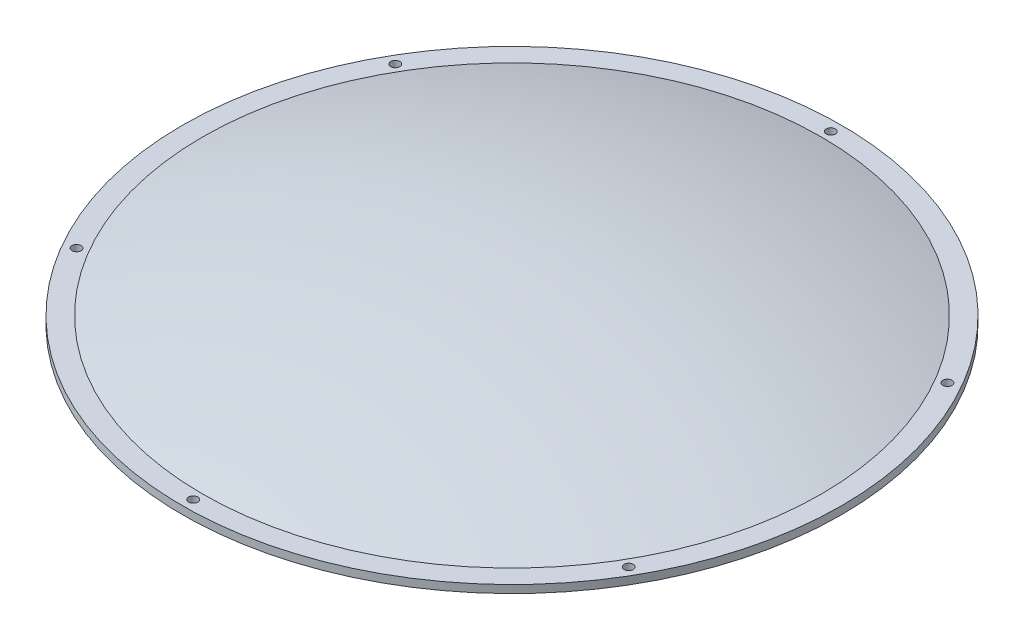
ISO-10303-21;
HEADER;
FILE_DESCRIPTION(('STEP AP214'),'2;1');
FILE_NAME('part.step','',(''),(''),'','','');
FILE_SCHEMA(('AUTOMOTIVE_DESIGN { 1 0 10303 214 1 1 1 1 }'));
ENDSEC;
DATA;
#1=APPLICATION_CONTEXT('core data for automotive mechanical design processes');
#2=APPLICATION_PROTOCOL_DEFINITION('international standard','automotive_design',2000,#1);
#3=PRODUCT_CONTEXT('',#1,'mechanical');
#4=PRODUCT('Part','Part','',(#3));
#5=PRODUCT_RELATED_PRODUCT_CATEGORY('part','',(#4));
#6=PRODUCT_DEFINITION_FORMATION('','',#4);
#7=PRODUCT_DEFINITION_CONTEXT('part definition',#1,'design');
#8=PRODUCT_DEFINITION('design','',#6,#7);
#9=PRODUCT_DEFINITION_SHAPE('','',#8);
#10=(LENGTH_UNIT() NAMED_UNIT(*) SI_UNIT(.MILLI.,.METRE.));
#11=(NAMED_UNIT(*) PLANE_ANGLE_UNIT() SI_UNIT($,.RADIAN.));
#12=(NAMED_UNIT(*) SI_UNIT($,.STERADIAN.) SOLID_ANGLE_UNIT());
#13=UNCERTAINTY_MEASURE_WITH_UNIT(LENGTH_MEASURE(1.E-05),#10,'distance_accuracy_value','');
#14=(GEOMETRIC_REPRESENTATION_CONTEXT(3) GLOBAL_UNCERTAINTY_ASSIGNED_CONTEXT((#13)) GLOBAL_UNIT_ASSIGNED_CONTEXT((#10,
#11,#12)) REPRESENTATION_CONTEXT('',''));
#15=CARTESIAN_POINT('',(0.,0.,0.));
#16=DIRECTION('',(0.,0.,1.));
#17=DIRECTION('',(1.,0.,0.));
#18=AXIS2_PLACEMENT_3D('',#15,#16,#17);
#19=CARTESIAN_POINT('',(0.,0.,0.));
#20=DIRECTION('',(0.,1.,0.));
#21=DIRECTION('',(1.,0.,0.));
#22=AXIS2_PLACEMENT_3D('',#19,#20,#21);
#23=SPHERICAL_SURFACE('',#22,300.);
#24=CARTESIAN_POINT('',(0.,282.842712474619,0.));
#25=DIRECTION('',(0.,1.,0.));
#26=DIRECTION('',(-1.,0.,0.));
#27=AXIS2_PLACEMENT_3D('',#24,#25,#26);
#28=CIRCLE('',#27,100.);
#29=CARTESIAN_POINT('',(-100.,282.842712474619,0.));
#30=VERTEX_POINT('',#29);
#31=EDGE_CURVE('E10',#30,#30,#28,.T.);
#32=ORIENTED_EDGE('',*,*,#31,.F.);
#33=EDGE_LOOP('',(#32));
#34=FACE_BOUND('',#33,.T.);
#35=ADVANCED_FACE('F38',(#34),#23,.F.);
#36=CARTESIAN_POINT('',(0.,282.842712474619,0.));
#37=DIRECTION('',(0.,1.,0.));
#38=DIRECTION('',(-1.,0.,0.));
#39=AXIS2_PLACEMENT_3D('',#36,#37,#38);
#40=PLANE('',#39);
#41=CARTESIAN_POINT('',(-89.6336292916894,282.842712474619,51.75));
#42=DIRECTION('',(0.,-1.,0.));
#43=DIRECTION('',(0.,0.,-1.));
#44=AXIS2_PLACEMENT_3D('',#41,#42,#43);
#45=CIRCLE('',#44,1.4732);
#46=CARTESIAN_POINT('',(-89.6336292916894,282.842712474619,50.2768));
#47=VERTEX_POINT('',#46);
#48=EDGE_CURVE('E88',#47,#47,#45,.T.);
#49=ORIENTED_EDGE('',*,*,#48,.F.);
#50=EDGE_LOOP('',(#49));
#51=FACE_BOUND('',#50,.T.);
#52=CARTESIAN_POINT('',(-89.6336292916894,282.842712474619,-51.7500000000001));
#53=DIRECTION('',(0.,-1.,0.));
#54=DIRECTION('',(0.,0.,-1.));
#55=AXIS2_PLACEMENT_3D('',#52,#53,#54);
#56=CIRCLE('',#55,1.4732);
#57=CARTESIAN_POINT('',(-89.6336292916894,282.842712474619,-53.2232000000001));
#58=VERTEX_POINT('',#57);
#59=EDGE_CURVE('E76',#58,#58,#56,.T.);
#60=ORIENTED_EDGE('',*,*,#59,.F.);
#61=EDGE_LOOP('',(#60));
#62=FACE_BOUND('',#61,.T.);
#63=CARTESIAN_POINT('',(0.,282.842712474619,-103.5));
#64=DIRECTION('',(0.,-1.,0.));
#65=DIRECTION('',(0.,0.,-1.));
#66=AXIS2_PLACEMENT_3D('',#63,#64,#65);
#67=CIRCLE('',#66,1.4732);
#68=CARTESIAN_POINT('',(0.,282.842712474619,-104.9732));
#69=VERTEX_POINT('',#68);
#70=EDGE_CURVE('E72',#69,#69,#67,.T.);
#71=ORIENTED_EDGE('',*,*,#70,.F.);
#72=EDGE_LOOP('',(#71));
#73=FACE_BOUND('',#72,.T.);
#74=CARTESIAN_POINT('',(89.6336292916894,282.842712474619,-51.75));
#75=DIRECTION('',(0.,-1.,0.));
#76=DIRECTION('',(0.,0.,-1.));
#77=AXIS2_PLACEMENT_3D('',#74,#75,#76);
#78=CIRCLE('',#77,1.4732);
#79=CARTESIAN_POINT('',(89.6336292916894,282.842712474619,-53.2232));
#80=VERTEX_POINT('',#79);
#81=EDGE_CURVE('E69',#80,#80,#78,.T.);
#82=ORIENTED_EDGE('',*,*,#81,.F.);
#83=EDGE_LOOP('',(#82));
#84=FACE_BOUND('',#83,.T.);
#85=CARTESIAN_POINT('',(89.6336292916893,282.842712474619,51.75));
#86=DIRECTION('',(0.,-1.,0.));
#87=DIRECTION('',(0.,0.,-1.));
#88=AXIS2_PLACEMENT_3D('',#85,#86,#87);
#89=CIRCLE('',#88,1.4732);
#90=CARTESIAN_POINT('',(89.6336292916893,282.842712474619,50.2768));
#91=VERTEX_POINT('',#90);
#92=EDGE_CURVE('E65',#91,#91,#89,.T.);
#93=ORIENTED_EDGE('',*,*,#92,.F.);
#94=EDGE_LOOP('',(#93));
#95=FACE_BOUND('',#94,.T.);
#96=CARTESIAN_POINT('',(0.,282.842712474619,103.5));
#97=DIRECTION('',(0.,-1.,0.));
#98=DIRECTION('',(0.,0.,-1.));
#99=AXIS2_PLACEMENT_3D('',#96,#97,#98);
#100=CIRCLE('',#99,1.4732);
#101=CARTESIAN_POINT('',(0.,282.842712474619,102.0268));
#102=VERTEX_POINT('',#101);
#103=EDGE_CURVE('E61',#102,#102,#100,.T.);
#104=ORIENTED_EDGE('',*,*,#103,.F.);
#105=EDGE_LOOP('',(#104));
#106=FACE_BOUND('',#105,.T.);
#107=CARTESIAN_POINT('',(0.,282.842712474619,0.));
#108=DIRECTION('',(0.,1.,0.));
#109=DIRECTION('',(-1.,0.,0.));
#110=AXIS2_PLACEMENT_3D('',#107,#108,#109);
#111=CIRCLE('',#110,107.);
#112=CARTESIAN_POINT('',(-107.,282.842712474619,0.));
#113=VERTEX_POINT('',#112);
#114=EDGE_CURVE('E46',#113,#113,#111,.T.);
#115=ORIENTED_EDGE('',*,*,#114,.F.);
#116=EDGE_LOOP('',(#115));
#117=FACE_BOUND('',#116,.T.);
#118=ORIENTED_EDGE('',*,*,#31,.T.);
#119=EDGE_LOOP('',(#118));
#120=FACE_BOUND('',#119,.T.);
#121=ADVANCED_FACE('F107',(#51,#62,#73,#84,#95,#106,#117,#120),#40,.F.);
#122=CARTESIAN_POINT('',(0.,282.842712474619,0.));
#123=DIRECTION('',(0.,1.,0.));
#124=DIRECTION('',(-1.,0.,0.));
#125=AXIS2_PLACEMENT_3D('',#122,#123,#124);
#126=CYLINDRICAL_SURFACE('',#125,107.);
#127=CARTESIAN_POINT('',(0.,285.382712474619,0.));
#128=DIRECTION('',(0.,1.,0.));
#129=DIRECTION('',(-1.,0.,0.));
#130=AXIS2_PLACEMENT_3D('',#127,#128,#129);
#131=CIRCLE('',#130,107.);
#132=CARTESIAN_POINT('',(-107.,285.382712474619,0.));
#133=VERTEX_POINT('',#132);
#134=EDGE_CURVE('E53',#133,#133,#131,.T.);
#135=ORIENTED_EDGE('',*,*,#134,.F.);
#136=EDGE_LOOP('',(#135));
#137=FACE_BOUND('',#136,.T.);
#138=ORIENTED_EDGE('',*,*,#114,.T.);
#139=EDGE_LOOP('',(#138));
#140=FACE_BOUND('',#139,.T.);
#141=ADVANCED_FACE('F104',(#137,#140),#126,.T.);
#142=CARTESIAN_POINT('',(0.,285.382712474619,0.));
#143=DIRECTION('',(0.,1.,0.));
#144=DIRECTION('',(-1.,0.,0.));
#145=AXIS2_PLACEMENT_3D('',#142,#143,#144);
#146=PLANE('',#145);
#147=CARTESIAN_POINT('',(-89.6336292916894,285.382712474619,51.75));
#148=DIRECTION('',(0.,1.,0.));
#149=DIRECTION('',(-1.,0.,0.));
#150=AXIS2_PLACEMENT_3D('',#147,#148,#149);
#151=CIRCLE('',#150,1.4732);
#152=CARTESIAN_POINT('',(-91.1068292916894,285.382712474619,51.75));
#153=VERTEX_POINT('',#152);
#154=EDGE_CURVE('E41',#153,#153,#151,.T.);
#155=ORIENTED_EDGE('',*,*,#154,.F.);
#156=EDGE_LOOP('',(#155));
#157=FACE_BOUND('',#156,.T.);
#158=CARTESIAN_POINT('',(-89.6336292916894,285.382712474619,-51.7500000000001));
#159=DIRECTION('',(0.,1.,0.));
#160=DIRECTION('',(-1.,0.,0.));
#161=AXIS2_PLACEMENT_3D('',#158,#159,#160);
#162=CIRCLE('',#161,1.4732);
#163=CARTESIAN_POINT('',(-91.1068292916894,285.382712474619,-51.7500000000001));
#164=VERTEX_POINT('',#163);
#165=EDGE_CURVE('E73',#164,#164,#162,.T.);
#166=ORIENTED_EDGE('',*,*,#165,.F.);
#167=EDGE_LOOP('',(#166));
#168=FACE_BOUND('',#167,.T.);
#169=CARTESIAN_POINT('',(0.,285.382712474619,-103.5));
#170=DIRECTION('',(0.,1.,0.));
#171=DIRECTION('',(-1.,0.,0.));
#172=AXIS2_PLACEMENT_3D('',#169,#170,#171);
#173=CIRCLE('',#172,1.4732);
#174=CARTESIAN_POINT('',(-1.4732,285.382712474619,-103.5));
#175=VERTEX_POINT('',#174);
#176=EDGE_CURVE('E70',#175,#175,#173,.T.);
#177=ORIENTED_EDGE('',*,*,#176,.F.);
#178=EDGE_LOOP('',(#177));
#179=FACE_BOUND('',#178,.T.);
#180=CARTESIAN_POINT('',(89.6336292916894,285.382712474619,-51.75));
#181=DIRECTION('',(0.,1.,0.));
#182=DIRECTION('',(-1.,0.,0.));
#183=AXIS2_PLACEMENT_3D('',#180,#181,#182);
#184=CIRCLE('',#183,1.4732);
#185=CARTESIAN_POINT('',(88.1604292916894,285.382712474619,-51.75));
#186=VERTEX_POINT('',#185);
#187=EDGE_CURVE('E66',#186,#186,#184,.T.);
#188=ORIENTED_EDGE('',*,*,#187,.F.);
#189=EDGE_LOOP('',(#188));
#190=FACE_BOUND('',#189,.T.);
#191=CARTESIAN_POINT('',(89.6336292916893,285.382712474619,51.75));
#192=DIRECTION('',(0.,1.,0.));
#193=DIRECTION('',(-1.,0.,0.));
#194=AXIS2_PLACEMENT_3D('',#191,#192,#193);
#195=CIRCLE('',#194,1.4732);
#196=CARTESIAN_POINT('',(88.1604292916894,285.382712474619,51.75));
#197=VERTEX_POINT('',#196);
#198=EDGE_CURVE('E62',#197,#197,#195,.T.);
#199=ORIENTED_EDGE('',*,*,#198,.F.);
#200=EDGE_LOOP('',(#199));
#201=FACE_BOUND('',#200,.T.);
#202=CARTESIAN_POINT('',(0.,285.382712474619,103.5));
#203=DIRECTION('',(0.,1.,0.));
#204=DIRECTION('',(-1.,0.,0.));
#205=AXIS2_PLACEMENT_3D('',#202,#203,#204);
#206=CIRCLE('',#205,1.4732);
#207=CARTESIAN_POINT('',(-1.47320000000004,285.382712474619,103.5));
#208=VERTEX_POINT('',#207);
#209=EDGE_CURVE('E57',#208,#208,#206,.T.);
#210=ORIENTED_EDGE('',*,*,#209,.F.);
#211=EDGE_LOOP('',(#210));
#212=FACE_BOUND('',#211,.T.);
#213=ORIENTED_EDGE('',*,*,#134,.T.);
#214=EDGE_LOOP('',(#213));
#215=FACE_BOUND('',#214,.T.);
#216=CARTESIAN_POINT('',(0.,285.382712474619,0.));
#217=DIRECTION('',(0.,1.,0.));
#218=DIRECTION('',(-1.,0.,0.));
#219=AXIS2_PLACEMENT_3D('',#216,#217,#218);
#220=CIRCLE('',#219,100.434849632132);
#221=CARTESIAN_POINT('',(-100.434849632132,285.382712474619,0.));
#222=VERTEX_POINT('',#221);
#223=EDGE_CURVE('E60',#222,#222,#220,.T.);
#224=ORIENTED_EDGE('',*,*,#223,.F.);
#225=EDGE_LOOP('',(#224));
#226=FACE_BOUND('',#225,.T.);
#227=ADVANCED_FACE('F101',(#157,#168,#179,#190,#201,#212,#215,#226),#146,.T.);
#228=CARTESIAN_POINT('',(0.,0.,0.));
#229=DIRECTION('',(0.,1.,0.));
#230=DIRECTION('',(1.,0.,0.));
#231=AXIS2_PLACEMENT_3D('',#228,#229,#230);
#232=SPHERICAL_SURFACE('',#231,302.54);
#233=ORIENTED_EDGE('',*,*,#223,.T.);
#234=EDGE_LOOP('',(#233));
#235=FACE_BOUND('',#234,.T.);
#236=ADVANCED_FACE('F122',(#235),#232,.T.);
#237=CARTESIAN_POINT('',(0.,302.54,103.5));
#238=DIRECTION('',(0.,-1.,0.));
#239=DIRECTION('',(0.,0.,-1.));
#240=AXIS2_PLACEMENT_3D('',#237,#238,#239);
#241=CYLINDRICAL_SURFACE('',#240,1.4732);
#242=ORIENTED_EDGE('',*,*,#209,.T.);
#243=EDGE_LOOP('',(#242));
#244=FACE_BOUND('',#243,.T.);
#245=ORIENTED_EDGE('',*,*,#103,.T.);
#246=EDGE_LOOP('',(#245));
#247=FACE_BOUND('',#246,.T.);
#248=ADVANCED_FACE('F126',(#244,#247),#241,.F.);
#249=CARTESIAN_POINT('',(89.6336292916893,302.54,51.75));
#250=DIRECTION('',(0.,-1.,0.));
#251=DIRECTION('',(0.,0.,-1.));
#252=AXIS2_PLACEMENT_3D('',#249,#250,#251);
#253=CYLINDRICAL_SURFACE('',#252,1.4732);
#254=ORIENTED_EDGE('',*,*,#198,.T.);
#255=EDGE_LOOP('',(#254));
#256=FACE_BOUND('',#255,.T.);
#257=ORIENTED_EDGE('',*,*,#92,.T.);
#258=EDGE_LOOP('',(#257));
#259=FACE_BOUND('',#258,.T.);
#260=ADVANCED_FACE('F130',(#256,#259),#253,.F.);
#261=CARTESIAN_POINT('',(89.6336292916894,302.54,-51.75));
#262=DIRECTION('',(0.,-1.,0.));
#263=DIRECTION('',(0.,0.,-1.));
#264=AXIS2_PLACEMENT_3D('',#261,#262,#263);
#265=CYLINDRICAL_SURFACE('',#264,1.4732);
#266=ORIENTED_EDGE('',*,*,#187,.T.);
#267=EDGE_LOOP('',(#266));
#268=FACE_BOUND('',#267,.T.);
#269=ORIENTED_EDGE('',*,*,#81,.T.);
#270=EDGE_LOOP('',(#269));
#271=FACE_BOUND('',#270,.T.);
#272=ADVANCED_FACE('F134',(#268,#271),#265,.F.);
#273=CARTESIAN_POINT('',(0.,302.54,-103.5));
#274=DIRECTION('',(0.,-1.,0.));
#275=DIRECTION('',(0.,0.,-1.));
#276=AXIS2_PLACEMENT_3D('',#273,#274,#275);
#277=CYLINDRICAL_SURFACE('',#276,1.4732);
#278=ORIENTED_EDGE('',*,*,#176,.T.);
#279=EDGE_LOOP('',(#278));
#280=FACE_BOUND('',#279,.T.);
#281=ORIENTED_EDGE('',*,*,#70,.T.);
#282=EDGE_LOOP('',(#281));
#283=FACE_BOUND('',#282,.T.);
#284=ADVANCED_FACE('F138',(#280,#283),#277,.F.);
#285=CARTESIAN_POINT('',(-89.6336292916894,302.54,-51.7500000000001));
#286=DIRECTION('',(0.,-1.,0.));
#287=DIRECTION('',(0.,0.,-1.));
#288=AXIS2_PLACEMENT_3D('',#285,#286,#287);
#289=CYLINDRICAL_SURFACE('',#288,1.4732);
#290=ORIENTED_EDGE('',*,*,#165,.T.);
#291=EDGE_LOOP('',(#290));
#292=FACE_BOUND('',#291,.T.);
#293=ORIENTED_EDGE('',*,*,#59,.T.);
#294=EDGE_LOOP('',(#293));
#295=FACE_BOUND('',#294,.T.);
#296=ADVANCED_FACE('F142',(#292,#295),#289,.F.);
#297=CARTESIAN_POINT('',(-89.6336292916894,302.54,51.75));
#298=DIRECTION('',(0.,-1.,0.));
#299=DIRECTION('',(0.,0.,-1.));
#300=AXIS2_PLACEMENT_3D('',#297,#298,#299);
#301=CYLINDRICAL_SURFACE('',#300,1.4732);
#302=ORIENTED_EDGE('',*,*,#154,.T.);
#303=EDGE_LOOP('',(#302));
#304=FACE_BOUND('',#303,.T.);
#305=ORIENTED_EDGE('',*,*,#48,.T.);
#306=EDGE_LOOP('',(#305));
#307=FACE_BOUND('',#306,.T.);
#308=ADVANCED_FACE('F146',(#304,#307),#301,.F.);
#309=CLOSED_SHELL('',(#35,#121,#141,#227,#236,#248,#260,#272,#284,#296,#308));
#310=MANIFOLD_SOLID_BREP('B2',#309);
#311=ADVANCED_BREP_SHAPE_REPRESENTATION('',(#18,#310),#14);
#312=SHAPE_DEFINITION_REPRESENTATION(#9,#311);
ENDSEC;
END-ISO-10303-21;
